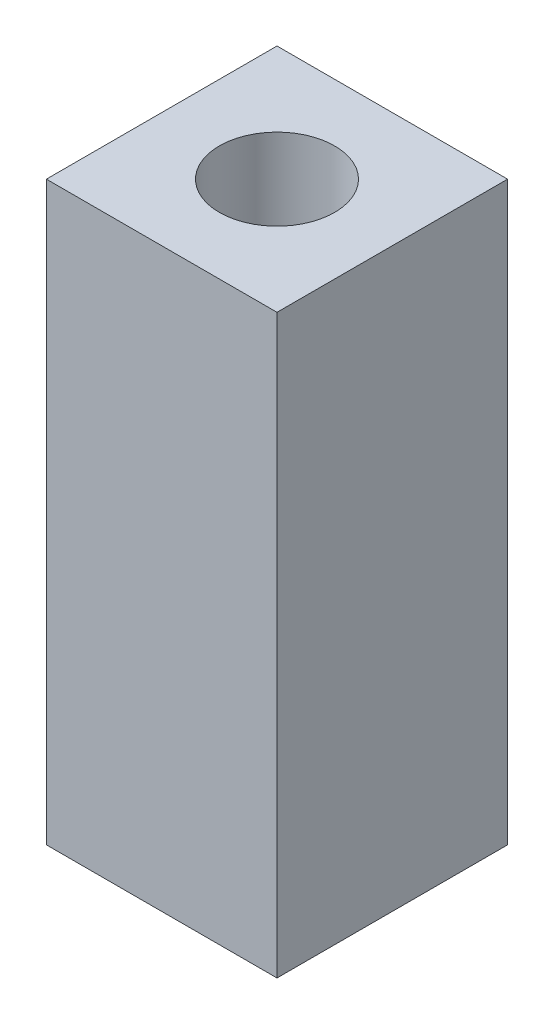
ISO-10303-21;
HEADER;
FILE_DESCRIPTION(('STEP AP214'),'2;1');
FILE_NAME('part.step','',(''),(''),'','','');
FILE_SCHEMA(('AUTOMOTIVE_DESIGN { 1 0 10303 214 1 1 1 1 }'));
ENDSEC;
DATA;
#1=APPLICATION_CONTEXT('core data for automotive mechanical design processes');
#2=APPLICATION_PROTOCOL_DEFINITION('international standard','automotive_design',2000,#1);
#3=PRODUCT_CONTEXT('',#1,'mechanical');
#4=PRODUCT('Part','Part','',(#3));
#5=PRODUCT_RELATED_PRODUCT_CATEGORY('part','',(#4));
#6=PRODUCT_DEFINITION_FORMATION('','',#4);
#7=PRODUCT_DEFINITION_CONTEXT('part definition',#1,'design');
#8=PRODUCT_DEFINITION('design','',#6,#7);
#9=PRODUCT_DEFINITION_SHAPE('','',#8);
#10=(LENGTH_UNIT() NAMED_UNIT(*) SI_UNIT(.MILLI.,.METRE.));
#11=(NAMED_UNIT(*) PLANE_ANGLE_UNIT() SI_UNIT($,.RADIAN.));
#12=(NAMED_UNIT(*) SI_UNIT($,.STERADIAN.) SOLID_ANGLE_UNIT());
#13=UNCERTAINTY_MEASURE_WITH_UNIT(LENGTH_MEASURE(1.E-05),#10,'distance_accuracy_value','');
#14=(GEOMETRIC_REPRESENTATION_CONTEXT(3) GLOBAL_UNCERTAINTY_ASSIGNED_CONTEXT((#13)) GLOBAL_UNIT_ASSIGNED_CONTEXT((#10,
#11,#12)) REPRESENTATION_CONTEXT('',''));
#15=CARTESIAN_POINT('',(0.,0.,0.));
#16=DIRECTION('',(0.,0.,1.));
#17=DIRECTION('',(1.,0.,0.));
#18=AXIS2_PLACEMENT_3D('',#15,#16,#17);
#19=CARTESIAN_POINT('',(0.,15.,0.));
#20=DIRECTION('',(1.,0.,0.));
#21=DIRECTION('',(0.,0.,-1.));
#22=AXIS2_PLACEMENT_3D('',#19,#20,#21);
#23=PLANE('',#22);
#24=DIRECTION('',(0.,0.,1.));
#25=VECTOR('',#24,1.);
#26=CARTESIAN_POINT('',(0.,0.,0.));
#27=LINE('',#26,#25);
#28=CARTESIAN_POINT('',(0.,0.,0.));
#29=VERTEX_POINT('',#28);
#30=CARTESIAN_POINT('',(0.,0.,6.));
#31=VERTEX_POINT('',#30);
#32=EDGE_CURVE('E107',#29,#31,#27,.T.);
#33=ORIENTED_EDGE('',*,*,#32,.T.);
#34=DIRECTION('',(0.,-1.,0.));
#35=VECTOR('',#34,1.);
#36=CARTESIAN_POINT('',(0.,15.,6.));
#37=LINE('',#36,#35);
#38=CARTESIAN_POINT('',(0.,15.,6.));
#39=VERTEX_POINT('',#38);
#40=EDGE_CURVE('E11',#39,#31,#37,.T.);
#41=ORIENTED_EDGE('',*,*,#40,.F.);
#42=DIRECTION('',(0.,0.,1.));
#43=VECTOR('',#42,1.);
#44=CARTESIAN_POINT('',(0.,15.,0.));
#45=LINE('',#44,#43);
#46=CARTESIAN_POINT('',(0.,15.,0.));
#47=VERTEX_POINT('',#46);
#48=EDGE_CURVE('E91',#47,#39,#45,.T.);
#49=ORIENTED_EDGE('',*,*,#48,.F.);
#50=DIRECTION('',(0.,-1.,0.));
#51=VECTOR('',#50,1.);
#52=CARTESIAN_POINT('',(0.,15.,0.));
#53=LINE('',#52,#51);
#54=EDGE_CURVE('E103',#47,#29,#53,.T.);
#55=ORIENTED_EDGE('',*,*,#54,.T.);
#56=EDGE_LOOP('',(#33,#41,#49,#55));
#57=FACE_BOUND('',#56,.T.);
#58=ADVANCED_FACE('F39',(#57),#23,.F.);
#59=CARTESIAN_POINT('',(0.,15.,6.));
#60=DIRECTION('',(0.,0.,-1.));
#61=DIRECTION('',(-1.,0.,0.));
#62=AXIS2_PLACEMENT_3D('',#59,#60,#61);
#63=PLANE('',#62);
#64=DIRECTION('',(1.,0.,0.));
#65=VECTOR('',#64,1.);
#66=CARTESIAN_POINT('',(0.,0.,6.));
#67=LINE('',#66,#65);
#68=CARTESIAN_POINT('',(6.,0.,6.));
#69=VERTEX_POINT('',#68);
#70=EDGE_CURVE('E96',#31,#69,#67,.T.);
#71=ORIENTED_EDGE('',*,*,#70,.T.);
#72=DIRECTION('',(0.,-1.,0.));
#73=VECTOR('',#72,1.);
#74=CARTESIAN_POINT('',(6.,15.,6.));
#75=LINE('',#74,#73);
#76=CARTESIAN_POINT('',(6.,15.,6.));
#77=VERTEX_POINT('',#76);
#78=EDGE_CURVE('E48',#77,#69,#75,.T.);
#79=ORIENTED_EDGE('',*,*,#78,.F.);
#80=DIRECTION('',(1.,0.,0.));
#81=VECTOR('',#80,1.);
#82=CARTESIAN_POINT('',(0.,15.,6.));
#83=LINE('',#82,#81);
#84=EDGE_CURVE('E86',#39,#77,#83,.T.);
#85=ORIENTED_EDGE('',*,*,#84,.F.);
#86=ORIENTED_EDGE('',*,*,#40,.T.);
#87=EDGE_LOOP('',(#71,#79,#85,#86));
#88=FACE_BOUND('',#87,.T.);
#89=ADVANCED_FACE('F95',(#88),#63,.F.);
#90=CARTESIAN_POINT('',(6.,15.,0.));
#91=DIRECTION('',(-1.,0.,0.));
#92=DIRECTION('',(0.,0.,1.));
#93=AXIS2_PLACEMENT_3D('',#90,#91,#92);
#94=PLANE('',#93);
#95=DIRECTION('',(0.,0.,-1.));
#96=VECTOR('',#95,1.);
#97=CARTESIAN_POINT('',(6.,0.,0.));
#98=LINE('',#97,#96);
#99=CARTESIAN_POINT('',(6.,0.,0.));
#100=VERTEX_POINT('',#99);
#101=EDGE_CURVE('E73',#69,#100,#98,.T.);
#102=ORIENTED_EDGE('',*,*,#101,.T.);
#103=DIRECTION('',(0.,-1.,0.));
#104=VECTOR('',#103,1.);
#105=CARTESIAN_POINT('',(6.,15.,0.));
#106=LINE('',#105,#104);
#107=CARTESIAN_POINT('',(6.,15.,0.));
#108=VERTEX_POINT('',#107);
#109=EDGE_CURVE('E98',#108,#100,#106,.T.);
#110=ORIENTED_EDGE('',*,*,#109,.F.);
#111=DIRECTION('',(0.,0.,-1.));
#112=VECTOR('',#111,1.);
#113=CARTESIAN_POINT('',(6.,15.,0.));
#114=LINE('',#113,#112);
#115=EDGE_CURVE('E89',#77,#108,#114,.T.);
#116=ORIENTED_EDGE('',*,*,#115,.F.);
#117=ORIENTED_EDGE('',*,*,#78,.T.);
#118=EDGE_LOOP('',(#102,#110,#116,#117));
#119=FACE_BOUND('',#118,.T.);
#120=ADVANCED_FACE('F99',(#119),#94,.F.);
#121=CARTESIAN_POINT('',(0.,15.,0.));
#122=DIRECTION('',(0.,0.,1.));
#123=DIRECTION('',(1.,0.,0.));
#124=AXIS2_PLACEMENT_3D('',#121,#122,#123);
#125=PLANE('',#124);
#126=DIRECTION('',(-1.,0.,0.));
#127=VECTOR('',#126,1.);
#128=CARTESIAN_POINT('',(0.,0.,0.));
#129=LINE('',#128,#127);
#130=EDGE_CURVE('E79',#100,#29,#129,.T.);
#131=ORIENTED_EDGE('',*,*,#130,.T.);
#132=ORIENTED_EDGE('',*,*,#54,.F.);
#133=DIRECTION('',(-1.,0.,0.));
#134=VECTOR('',#133,1.);
#135=CARTESIAN_POINT('',(0.,15.,0.));
#136=LINE('',#135,#134);
#137=EDGE_CURVE('E56',#108,#47,#136,.T.);
#138=ORIENTED_EDGE('',*,*,#137,.F.);
#139=ORIENTED_EDGE('',*,*,#109,.T.);
#140=EDGE_LOOP('',(#131,#132,#138,#139));
#141=FACE_BOUND('',#140,.T.);
#142=ADVANCED_FACE('F121',(#141),#125,.F.);
#143=CARTESIAN_POINT('',(0.,15.,0.));
#144=DIRECTION('',(0.,1.,0.));
#145=DIRECTION('',(0.,0.,1.));
#146=AXIS2_PLACEMENT_3D('',#143,#144,#145);
#147=PLANE('',#146);
#148=CARTESIAN_POINT('',(3.,15.,3.));
#149=DIRECTION('',(0.,1.,0.));
#150=DIRECTION('',(0.,0.,1.));
#151=AXIS2_PLACEMENT_3D('',#148,#149,#150);
#152=CIRCLE('',#151,1.5);
#153=CARTESIAN_POINT('',(3.,15.,4.5));
#154=VERTEX_POINT('',#153);
#155=EDGE_CURVE('E128',#154,#154,#152,.T.);
#156=ORIENTED_EDGE('',*,*,#155,.F.);
#157=EDGE_LOOP('',(#156));
#158=FACE_BOUND('',#157,.T.);
#159=ORIENTED_EDGE('',*,*,#48,.T.);
#160=ORIENTED_EDGE('',*,*,#84,.T.);
#161=ORIENTED_EDGE('',*,*,#115,.T.);
#162=ORIENTED_EDGE('',*,*,#137,.T.);
#163=EDGE_LOOP('',(#159,#160,#161,#162));
#164=FACE_BOUND('',#163,.T.);
#165=ADVANCED_FACE('F87',(#158,#164),#147,.T.);
#166=CARTESIAN_POINT('',(0.,0.,0.));
#167=DIRECTION('',(0.,1.,0.));
#168=DIRECTION('',(0.,0.,1.));
#169=AXIS2_PLACEMENT_3D('',#166,#167,#168);
#170=PLANE('',#169);
#171=CARTESIAN_POINT('',(3.,0.,3.));
#172=DIRECTION('',(0.,1.,0.));
#173=DIRECTION('',(0.,0.,1.));
#174=AXIS2_PLACEMENT_3D('',#171,#172,#173);
#175=CIRCLE('',#174,1.5);
#176=CARTESIAN_POINT('',(3.,0.,4.5));
#177=VERTEX_POINT('',#176);
#178=EDGE_CURVE('E111',#177,#177,#175,.T.);
#179=ORIENTED_EDGE('',*,*,#178,.T.);
#180=EDGE_LOOP('',(#179));
#181=FACE_BOUND('',#180,.T.);
#182=ORIENTED_EDGE('',*,*,#32,.F.);
#183=ORIENTED_EDGE('',*,*,#130,.F.);
#184=ORIENTED_EDGE('',*,*,#101,.F.);
#185=ORIENTED_EDGE('',*,*,#70,.F.);
#186=EDGE_LOOP('',(#182,#183,#184,#185));
#187=FACE_BOUND('',#186,.T.);
#188=ADVANCED_FACE('F124',(#181,#187),#170,.F.);
#189=CARTESIAN_POINT('',(3.,0.,3.));
#190=DIRECTION('',(0.,1.,0.));
#191=DIRECTION('',(0.,0.,1.));
#192=AXIS2_PLACEMENT_3D('',#189,#190,#191);
#193=CYLINDRICAL_SURFACE('',#192,1.5);
#194=ORIENTED_EDGE('',*,*,#178,.F.);
#195=EDGE_LOOP('',(#194));
#196=FACE_BOUND('',#195,.T.);
#197=ORIENTED_EDGE('',*,*,#155,.T.);
#198=EDGE_LOOP('',(#197));
#199=FACE_BOUND('',#198,.T.);
#200=ADVANCED_FACE('F137',(#196,#199),#193,.F.);
#201=CLOSED_SHELL('',(#58,#89,#120,#142,#165,#188,#200));
#202=MANIFOLD_SOLID_BREP('B2',#201);
#203=ADVANCED_BREP_SHAPE_REPRESENTATION('',(#18,#202),#14);
#204=SHAPE_DEFINITION_REPRESENTATION(#9,#203);
ENDSEC;
END-ISO-10303-21;
